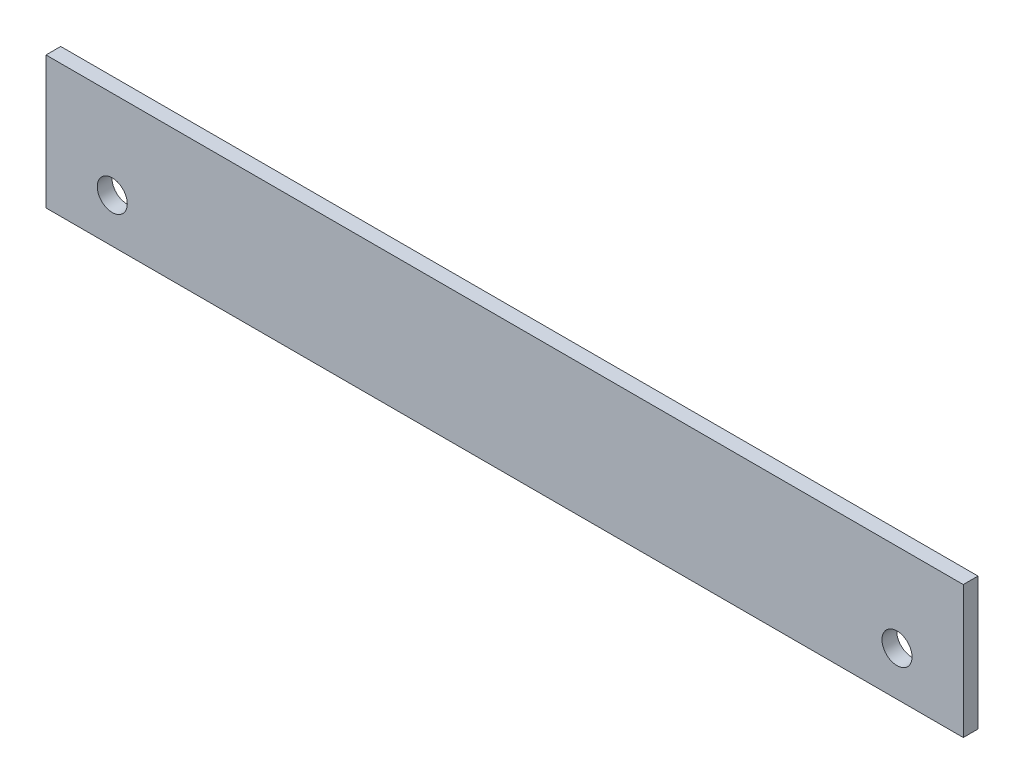
ISO-10303-21;
HEADER;
FILE_DESCRIPTION(('STEP AP214'),'2;1');
FILE_NAME('part.step','',(''),(''),'','','');
FILE_SCHEMA(('AUTOMOTIVE_DESIGN { 1 0 10303 214 1 1 1 1 }'));
ENDSEC;
DATA;
#1=APPLICATION_CONTEXT('core data for automotive mechanical design processes');
#2=APPLICATION_PROTOCOL_DEFINITION('international standard','automotive_design',2000,#1);
#3=PRODUCT_CONTEXT('',#1,'mechanical');
#4=PRODUCT('Part','Part','',(#3));
#5=PRODUCT_RELATED_PRODUCT_CATEGORY('part','',(#4));
#6=PRODUCT_DEFINITION_FORMATION('','',#4);
#7=PRODUCT_DEFINITION_CONTEXT('part definition',#1,'design');
#8=PRODUCT_DEFINITION('design','',#6,#7);
#9=PRODUCT_DEFINITION_SHAPE('','',#8);
#10=(LENGTH_UNIT() NAMED_UNIT(*) SI_UNIT(.MILLI.,.METRE.));
#11=(NAMED_UNIT(*) PLANE_ANGLE_UNIT() SI_UNIT($,.RADIAN.));
#12=(NAMED_UNIT(*) SI_UNIT($,.STERADIAN.) SOLID_ANGLE_UNIT());
#13=UNCERTAINTY_MEASURE_WITH_UNIT(LENGTH_MEASURE(1.E-05),#10,'distance_accuracy_value','');
#14=(GEOMETRIC_REPRESENTATION_CONTEXT(3) GLOBAL_UNCERTAINTY_ASSIGNED_CONTEXT((#13)) GLOBAL_UNIT_ASSIGNED_CONTEXT((#10,
#11,#12)) REPRESENTATION_CONTEXT('',''));
#15=CARTESIAN_POINT('',(0.,0.,0.));
#16=DIRECTION('',(0.,0.,1.));
#17=DIRECTION('',(1.,0.,0.));
#18=AXIS2_PLACEMENT_3D('',#15,#16,#17);
#19=CARTESIAN_POINT('',(-155.75,0.,2.5));
#20=DIRECTION('',(-1.,0.,0.));
#21=DIRECTION('',(0.,0.,1.));
#22=AXIS2_PLACEMENT_3D('',#19,#20,#21);
#23=PLANE('',#22);
#24=DIRECTION('',(0.,1.,0.));
#25=VECTOR('',#24,1.);
#26=CARTESIAN_POINT('',(-155.75,0.,-2.5));
#27=LINE('',#26,#25);
#28=CARTESIAN_POINT('',(-155.75,-22.5,-2.5));
#29=VERTEX_POINT('',#28);
#30=CARTESIAN_POINT('',(-155.75,22.5,-2.5));
#31=VERTEX_POINT('',#30);
#32=EDGE_CURVE('E107',#29,#31,#27,.T.);
#33=ORIENTED_EDGE('',*,*,#32,.F.);
#34=DIRECTION('',(0.,0.,-1.));
#35=VECTOR('',#34,1.);
#36=CARTESIAN_POINT('',(-155.75,-22.5,2.5));
#37=LINE('',#36,#35);
#38=CARTESIAN_POINT('',(-155.75,-22.5,2.5));
#39=VERTEX_POINT('',#38);
#40=EDGE_CURVE('E11',#39,#29,#37,.T.);
#41=ORIENTED_EDGE('',*,*,#40,.F.);
#42=DIRECTION('',(0.,1.,0.));
#43=VECTOR('',#42,1.);
#44=CARTESIAN_POINT('',(-155.75,0.,2.5));
#45=LINE('',#44,#43);
#46=CARTESIAN_POINT('',(-155.75,22.5,2.5));
#47=VERTEX_POINT('',#46);
#48=EDGE_CURVE('E100',#39,#47,#45,.T.);
#49=ORIENTED_EDGE('',*,*,#48,.T.);
#50=DIRECTION('',(0.,0.,-1.));
#51=VECTOR('',#50,1.);
#52=CARTESIAN_POINT('',(-155.75,22.5,2.5));
#53=LINE('',#52,#51);
#54=EDGE_CURVE('E81',#47,#31,#53,.T.);
#55=ORIENTED_EDGE('',*,*,#54,.T.);
#56=EDGE_LOOP('',(#33,#41,#49,#55));
#57=FACE_BOUND('',#56,.T.);
#58=ADVANCED_FACE('F43',(#57),#23,.T.);
#59=CARTESIAN_POINT('',(0.,-22.5,2.5));
#60=DIRECTION('',(0.,-1.,0.));
#61=DIRECTION('',(1.,0.,0.));
#62=AXIS2_PLACEMENT_3D('',#59,#60,#61);
#63=PLANE('',#62);
#64=DIRECTION('',(-1.,0.,0.));
#65=VECTOR('',#64,1.);
#66=CARTESIAN_POINT('',(0.,-22.5,-2.5));
#67=LINE('',#66,#65);
#68=CARTESIAN_POINT('',(155.75,-22.5,-2.5));
#69=VERTEX_POINT('',#68);
#70=EDGE_CURVE('E94',#69,#29,#67,.T.);
#71=ORIENTED_EDGE('',*,*,#70,.F.);
#72=DIRECTION('',(0.,0.,-1.));
#73=VECTOR('',#72,1.);
#74=CARTESIAN_POINT('',(155.75,-22.5,2.5));
#75=LINE('',#74,#73);
#76=CARTESIAN_POINT('',(155.75,-22.5,2.5));
#77=VERTEX_POINT('',#76);
#78=EDGE_CURVE('E51',#77,#69,#75,.T.);
#79=ORIENTED_EDGE('',*,*,#78,.F.);
#80=DIRECTION('',(-1.,0.,0.));
#81=VECTOR('',#80,1.);
#82=CARTESIAN_POINT('',(0.,-22.5,2.5));
#83=LINE('',#82,#81);
#84=EDGE_CURVE('E92',#77,#39,#83,.T.);
#85=ORIENTED_EDGE('',*,*,#84,.T.);
#86=ORIENTED_EDGE('',*,*,#40,.T.);
#87=EDGE_LOOP('',(#71,#79,#85,#86));
#88=FACE_BOUND('',#87,.T.);
#89=ADVANCED_FACE('F90',(#88),#63,.T.);
#90=CARTESIAN_POINT('',(155.75,0.,2.5));
#91=DIRECTION('',(-1.,0.,0.));
#92=DIRECTION('',(0.,0.,1.));
#93=AXIS2_PLACEMENT_3D('',#90,#91,#92);
#94=PLANE('',#93);
#95=DIRECTION('',(0.,1.,0.));
#96=VECTOR('',#95,1.);
#97=CARTESIAN_POINT('',(155.75,0.,-2.5));
#98=LINE('',#97,#96);
#99=CARTESIAN_POINT('',(155.75,22.5,-2.5));
#100=VERTEX_POINT('',#99);
#101=EDGE_CURVE('E74',#69,#100,#98,.T.);
#102=ORIENTED_EDGE('',*,*,#101,.T.);
#103=DIRECTION('',(0.,0.,-1.));
#104=VECTOR('',#103,1.);
#105=CARTESIAN_POINT('',(155.75,22.5,2.5));
#106=LINE('',#105,#104);
#107=CARTESIAN_POINT('',(155.75,22.5,2.5));
#108=VERTEX_POINT('',#107);
#109=EDGE_CURVE('E95',#108,#100,#106,.T.);
#110=ORIENTED_EDGE('',*,*,#109,.F.);
#111=DIRECTION('',(0.,1.,0.));
#112=VECTOR('',#111,1.);
#113=CARTESIAN_POINT('',(155.75,0.,2.5));
#114=LINE('',#113,#112);
#115=EDGE_CURVE('E96',#77,#108,#114,.T.);
#116=ORIENTED_EDGE('',*,*,#115,.F.);
#117=ORIENTED_EDGE('',*,*,#78,.T.);
#118=EDGE_LOOP('',(#102,#110,#116,#117));
#119=FACE_BOUND('',#118,.T.);
#120=ADVANCED_FACE('F97',(#119),#94,.F.);
#121=CARTESIAN_POINT('',(0.,22.5,2.5));
#122=DIRECTION('',(0.,-1.,0.));
#123=DIRECTION('',(1.,0.,0.));
#124=AXIS2_PLACEMENT_3D('',#121,#122,#123);
#125=PLANE('',#124);
#126=DIRECTION('',(-1.,0.,0.));
#127=VECTOR('',#126,1.);
#128=CARTESIAN_POINT('',(0.,22.5,-2.5));
#129=LINE('',#128,#127);
#130=EDGE_CURVE('E102',#100,#31,#129,.T.);
#131=ORIENTED_EDGE('',*,*,#130,.T.);
#132=ORIENTED_EDGE('',*,*,#54,.F.);
#133=DIRECTION('',(-1.,0.,0.));
#134=VECTOR('',#133,1.);
#135=CARTESIAN_POINT('',(0.,22.5,2.5));
#136=LINE('',#135,#134);
#137=EDGE_CURVE('E59',#108,#47,#136,.T.);
#138=ORIENTED_EDGE('',*,*,#137,.F.);
#139=ORIENTED_EDGE('',*,*,#109,.T.);
#140=EDGE_LOOP('',(#131,#132,#138,#139));
#141=FACE_BOUND('',#140,.T.);
#142=ADVANCED_FACE('F117',(#141),#125,.F.);
#143=CARTESIAN_POINT('',(0.,0.,2.5));
#144=DIRECTION('',(0.,0.,1.));
#145=DIRECTION('',(1.,0.,0.));
#146=AXIS2_PLACEMENT_3D('',#143,#144,#145);
#147=PLANE('',#146);
#148=CARTESIAN_POINT('',(-133.249958453999,-7.49999999999999,2.5));
#149=DIRECTION('',(0.,0.,1.));
#150=DIRECTION('',(1.,0.,0.));
#151=AXIS2_PLACEMENT_3D('',#148,#149,#150);
#152=CIRCLE('',#151,5.09999999999999);
#153=CARTESIAN_POINT('',(-128.149958453999,-7.49999999999999,2.5));
#154=VERTEX_POINT('',#153);
#155=EDGE_CURVE('E152',#154,#154,#152,.T.);
#156=ORIENTED_EDGE('',*,*,#155,.F.);
#157=EDGE_LOOP('',(#156));
#158=FACE_BOUND('',#157,.T.);
#159=CARTESIAN_POINT('',(133.24999863065,-7.49999999999999,2.5));
#160=DIRECTION('',(0.,0.,1.));
#161=DIRECTION('',(1.,0.,0.));
#162=AXIS2_PLACEMENT_3D('',#159,#160,#161);
#163=CIRCLE('',#162,5.09999999999999);
#164=CARTESIAN_POINT('',(138.34999863065,-7.49999999999999,2.5));
#165=VERTEX_POINT('',#164);
#166=EDGE_CURVE('E154',#165,#165,#163,.T.);
#167=ORIENTED_EDGE('',*,*,#166,.F.);
#168=EDGE_LOOP('',(#167));
#169=FACE_BOUND('',#168,.T.);
#170=ORIENTED_EDGE('',*,*,#48,.F.);
#171=ORIENTED_EDGE('',*,*,#84,.F.);
#172=ORIENTED_EDGE('',*,*,#115,.T.);
#173=ORIENTED_EDGE('',*,*,#137,.T.);
#174=EDGE_LOOP('',(#170,#171,#172,#173));
#175=FACE_BOUND('',#174,.T.);
#176=ADVANCED_FACE('F99',(#158,#169,#175),#147,.T.);
#177=CARTESIAN_POINT('',(0.,0.,-2.5));
#178=DIRECTION('',(0.,0.,1.));
#179=DIRECTION('',(1.,0.,0.));
#180=AXIS2_PLACEMENT_3D('',#177,#178,#179);
#181=PLANE('',#180);
#182=CARTESIAN_POINT('',(-133.249958453999,-7.49999999999999,-2.5));
#183=DIRECTION('',(0.,0.,1.));
#184=DIRECTION('',(1.,0.,0.));
#185=AXIS2_PLACEMENT_3D('',#182,#183,#184);
#186=CIRCLE('',#185,5.09999999999999);
#187=CARTESIAN_POINT('',(-128.149958453999,-7.49999999999999,-2.5));
#188=VERTEX_POINT('',#187);
#189=EDGE_CURVE('E149',#188,#188,#186,.T.);
#190=ORIENTED_EDGE('',*,*,#189,.T.);
#191=EDGE_LOOP('',(#190));
#192=FACE_BOUND('',#191,.T.);
#193=CARTESIAN_POINT('',(133.24999863065,-7.49999999999999,-2.5));
#194=DIRECTION('',(0.,0.,1.));
#195=DIRECTION('',(1.,0.,0.));
#196=AXIS2_PLACEMENT_3D('',#193,#194,#195);
#197=CIRCLE('',#196,5.09999999999999);
#198=CARTESIAN_POINT('',(138.34999863065,-7.49999999999999,-2.5));
#199=VERTEX_POINT('',#198);
#200=EDGE_CURVE('E110',#199,#199,#197,.T.);
#201=ORIENTED_EDGE('',*,*,#200,.T.);
#202=EDGE_LOOP('',(#201));
#203=FACE_BOUND('',#202,.T.);
#204=ORIENTED_EDGE('',*,*,#32,.T.);
#205=ORIENTED_EDGE('',*,*,#130,.F.);
#206=ORIENTED_EDGE('',*,*,#101,.F.);
#207=ORIENTED_EDGE('',*,*,#70,.T.);
#208=EDGE_LOOP('',(#204,#205,#206,#207));
#209=FACE_BOUND('',#208,.T.);
#210=ADVANCED_FACE('F119',(#192,#203,#209),#181,.F.);
#211=CARTESIAN_POINT('',(133.24999863065,-7.49999999999999,2.5));
#212=DIRECTION('',(0.,0.,1.));
#213=DIRECTION('',(1.,0.,0.));
#214=AXIS2_PLACEMENT_3D('',#211,#212,#213);
#215=CYLINDRICAL_SURFACE('',#214,5.09999999999999);
#216=ORIENTED_EDGE('',*,*,#200,.F.);
#217=EDGE_LOOP('',(#216));
#218=FACE_BOUND('',#217,.T.);
#219=ORIENTED_EDGE('',*,*,#166,.T.);
#220=EDGE_LOOP('',(#219));
#221=FACE_BOUND('',#220,.T.);
#222=ADVANCED_FACE('F133',(#218,#221),#215,.F.);
#223=CARTESIAN_POINT('',(-133.249958453999,-7.49999999999999,2.5));
#224=DIRECTION('',(0.,0.,1.));
#225=DIRECTION('',(1.,0.,0.));
#226=AXIS2_PLACEMENT_3D('',#223,#224,#225);
#227=CYLINDRICAL_SURFACE('',#226,5.09999999999999);
#228=ORIENTED_EDGE('',*,*,#189,.F.);
#229=EDGE_LOOP('',(#228));
#230=FACE_BOUND('',#229,.T.);
#231=ORIENTED_EDGE('',*,*,#155,.T.);
#232=EDGE_LOOP('',(#231));
#233=FACE_BOUND('',#232,.T.);
#234=ADVANCED_FACE('F140',(#230,#233),#227,.F.);
#235=CLOSED_SHELL('',(#58,#89,#120,#142,#176,#210,#222,#234));
#236=MANIFOLD_SOLID_BREP('B2',#235);
#237=ADVANCED_BREP_SHAPE_REPRESENTATION('',(#18,#236),#14);
#238=SHAPE_DEFINITION_REPRESENTATION(#9,#237);
ENDSEC;
END-ISO-10303-21;
